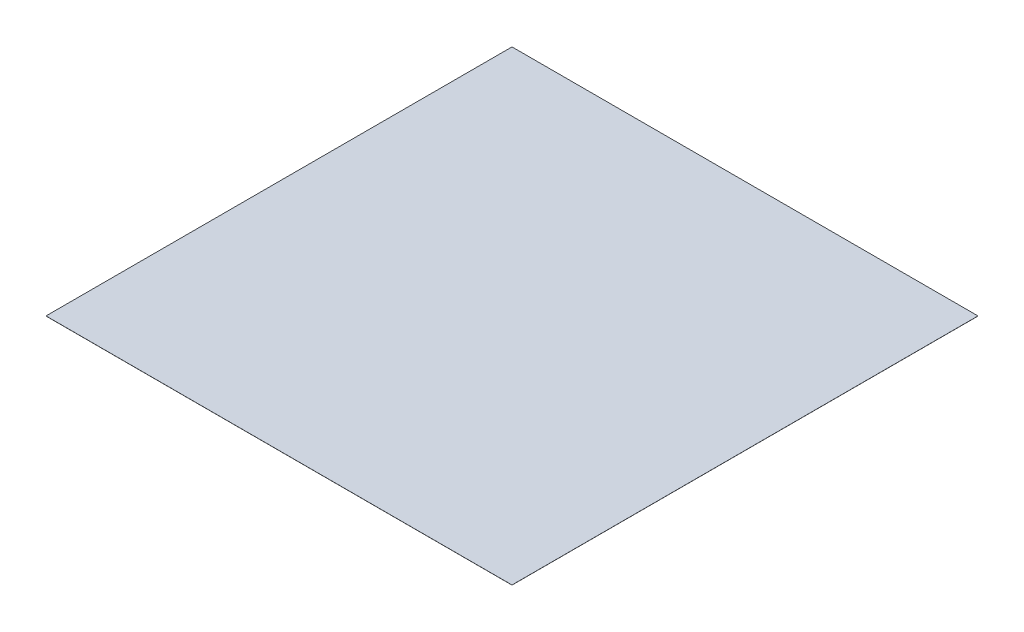
ISO-10303-21;
HEADER;
FILE_DESCRIPTION(('STEP AP214'),'2;1');
FILE_NAME('part.step','',(''),(''),'','','');
FILE_SCHEMA(('AUTOMOTIVE_DESIGN { 1 0 10303 214 1 1 1 1 }'));
ENDSEC;
DATA;
#1=APPLICATION_CONTEXT('core data for automotive mechanical design processes');
#2=APPLICATION_PROTOCOL_DEFINITION('international standard','automotive_design',2000,#1);
#3=PRODUCT_CONTEXT('',#1,'mechanical');
#4=PRODUCT('Part','Part','',(#3));
#5=PRODUCT_RELATED_PRODUCT_CATEGORY('part','',(#4));
#6=PRODUCT_DEFINITION_FORMATION('','',#4);
#7=PRODUCT_DEFINITION_CONTEXT('part definition',#1,'design');
#8=PRODUCT_DEFINITION('design','',#6,#7);
#9=PRODUCT_DEFINITION_SHAPE('','',#8);
#10=(LENGTH_UNIT() NAMED_UNIT(*) SI_UNIT(.MILLI.,.METRE.));
#11=(NAMED_UNIT(*) PLANE_ANGLE_UNIT() SI_UNIT($,.RADIAN.));
#12=(NAMED_UNIT(*) SI_UNIT($,.STERADIAN.) SOLID_ANGLE_UNIT());
#13=UNCERTAINTY_MEASURE_WITH_UNIT(LENGTH_MEASURE(1.E-05),#10,'distance_accuracy_value','');
#14=(GEOMETRIC_REPRESENTATION_CONTEXT(3) GLOBAL_UNCERTAINTY_ASSIGNED_CONTEXT((#13)) GLOBAL_UNIT_ASSIGNED_CONTEXT((#10,
#11,#12)) REPRESENTATION_CONTEXT('',''));
#15=CARTESIAN_POINT('',(0.,0.,0.));
#16=DIRECTION('',(0.,0.,1.));
#17=DIRECTION('',(1.,0.,0.));
#18=AXIS2_PLACEMENT_3D('',#15,#16,#17);
#19=CARTESIAN_POINT('',(400.,0.2,400.));
#20=DIRECTION('',(-1.,0.,0.));
#21=DIRECTION('',(0.,0.,1.));
#22=AXIS2_PLACEMENT_3D('',#19,#20,#21);
#23=PLANE('',#22);
#24=DIRECTION('',(0.,0.,-1.));
#25=VECTOR('',#24,1.);
#26=CARTESIAN_POINT('',(400.,0.,400.));
#27=LINE('',#26,#25);
#28=CARTESIAN_POINT('',(400.,0.,400.));
#29=VERTEX_POINT('',#28);
#30=CARTESIAN_POINT('',(400.,0.,-400.));
#31=VERTEX_POINT('',#30);
#32=EDGE_CURVE('E102',#29,#31,#27,.T.);
#33=ORIENTED_EDGE('',*,*,#32,.T.);
#34=DIRECTION('',(0.,-1.,0.));
#35=VECTOR('',#34,1.);
#36=CARTESIAN_POINT('',(400.,0.2,-400.));
#37=LINE('',#36,#35);
#38=CARTESIAN_POINT('',(400.,0.2,-400.));
#39=VERTEX_POINT('',#38);
#40=EDGE_CURVE('E11',#39,#31,#37,.T.);
#41=ORIENTED_EDGE('',*,*,#40,.F.);
#42=DIRECTION('',(0.,0.,-1.));
#43=VECTOR('',#42,1.);
#44=CARTESIAN_POINT('',(400.,0.2,400.));
#45=LINE('',#44,#43);
#46=CARTESIAN_POINT('',(400.,0.2,400.));
#47=VERTEX_POINT('',#46);
#48=EDGE_CURVE('E95',#47,#39,#45,.T.);
#49=ORIENTED_EDGE('',*,*,#48,.F.);
#50=DIRECTION('',(0.,-1.,0.));
#51=VECTOR('',#50,1.);
#52=CARTESIAN_POINT('',(400.,0.2,400.));
#53=LINE('',#52,#51);
#54=EDGE_CURVE('E99',#47,#29,#53,.T.);
#55=ORIENTED_EDGE('',*,*,#54,.T.);
#56=EDGE_LOOP('',(#33,#41,#49,#55));
#57=FACE_BOUND('',#56,.T.);
#58=ADVANCED_FACE('F41',(#57),#23,.F.);
#59=CARTESIAN_POINT('',(-400.,0.2,-400.));
#60=DIRECTION('',(0.,0.,1.));
#61=DIRECTION('',(1.,0.,0.));
#62=AXIS2_PLACEMENT_3D('',#59,#60,#61);
#63=PLANE('',#62);
#64=DIRECTION('',(-1.,0.,0.));
#65=VECTOR('',#64,1.);
#66=CARTESIAN_POINT('',(-400.,0.,-400.));
#67=LINE('',#66,#65);
#68=CARTESIAN_POINT('',(-400.,0.,-400.));
#69=VERTEX_POINT('',#68);
#70=EDGE_CURVE('E96',#31,#69,#67,.T.);
#71=ORIENTED_EDGE('',*,*,#70,.T.);
#72=DIRECTION('',(0.,-1.,0.));
#73=VECTOR('',#72,1.);
#74=CARTESIAN_POINT('',(-400.,0.2,-400.));
#75=LINE('',#74,#73);
#76=CARTESIAN_POINT('',(-400.,0.2,-400.));
#77=VERTEX_POINT('',#76);
#78=EDGE_CURVE('E47',#77,#69,#75,.T.);
#79=ORIENTED_EDGE('',*,*,#78,.F.);
#80=DIRECTION('',(-1.,0.,0.));
#81=VECTOR('',#80,1.);
#82=CARTESIAN_POINT('',(-400.,0.2,-400.));
#83=LINE('',#82,#81);
#84=EDGE_CURVE('E87',#39,#77,#83,.T.);
#85=ORIENTED_EDGE('',*,*,#84,.F.);
#86=ORIENTED_EDGE('',*,*,#40,.T.);
#87=EDGE_LOOP('',(#71,#79,#85,#86));
#88=FACE_BOUND('',#87,.T.);
#89=ADVANCED_FACE('F92',(#88),#63,.F.);
#90=CARTESIAN_POINT('',(-400.,0.2,400.));
#91=DIRECTION('',(1.,0.,0.));
#92=DIRECTION('',(0.,0.,-1.));
#93=AXIS2_PLACEMENT_3D('',#90,#91,#92);
#94=PLANE('',#93);
#95=DIRECTION('',(0.,0.,1.));
#96=VECTOR('',#95,1.);
#97=CARTESIAN_POINT('',(-400.,0.,400.));
#98=LINE('',#97,#96);
#99=CARTESIAN_POINT('',(-400.,0.,400.));
#100=VERTEX_POINT('',#99);
#101=EDGE_CURVE('E74',#69,#100,#98,.T.);
#102=ORIENTED_EDGE('',*,*,#101,.T.);
#103=DIRECTION('',(0.,-1.,0.));
#104=VECTOR('',#103,1.);
#105=CARTESIAN_POINT('',(-400.,0.2,400.));
#106=LINE('',#105,#104);
#107=CARTESIAN_POINT('',(-400.,0.2,400.));
#108=VERTEX_POINT('',#107);
#109=EDGE_CURVE('E100',#108,#100,#106,.T.);
#110=ORIENTED_EDGE('',*,*,#109,.F.);
#111=DIRECTION('',(0.,0.,1.));
#112=VECTOR('',#111,1.);
#113=CARTESIAN_POINT('',(-400.,0.2,400.));
#114=LINE('',#113,#112);
#115=EDGE_CURVE('E89',#77,#108,#114,.T.);
#116=ORIENTED_EDGE('',*,*,#115,.F.);
#117=ORIENTED_EDGE('',*,*,#78,.T.);
#118=EDGE_LOOP('',(#102,#110,#116,#117));
#119=FACE_BOUND('',#118,.T.);
#120=ADVANCED_FACE('F98',(#119),#94,.F.);
#121=CARTESIAN_POINT('',(-400.,0.2,400.));
#122=DIRECTION('',(0.,0.,-1.));
#123=DIRECTION('',(-1.,0.,0.));
#124=AXIS2_PLACEMENT_3D('',#121,#122,#123);
#125=PLANE('',#124);
#126=DIRECTION('',(1.,0.,0.));
#127=VECTOR('',#126,1.);
#128=CARTESIAN_POINT('',(-400.,0.,400.));
#129=LINE('',#128,#127);
#130=EDGE_CURVE('E79',#100,#29,#129,.T.);
#131=ORIENTED_EDGE('',*,*,#130,.T.);
#132=ORIENTED_EDGE('',*,*,#54,.F.);
#133=DIRECTION('',(1.,0.,0.));
#134=VECTOR('',#133,1.);
#135=CARTESIAN_POINT('',(-400.,0.2,400.));
#136=LINE('',#135,#134);
#137=EDGE_CURVE('E60',#108,#47,#136,.T.);
#138=ORIENTED_EDGE('',*,*,#137,.F.);
#139=ORIENTED_EDGE('',*,*,#109,.T.);
#140=EDGE_LOOP('',(#131,#132,#138,#139));
#141=FACE_BOUND('',#140,.T.);
#142=ADVANCED_FACE('F112',(#141),#125,.F.);
#143=CARTESIAN_POINT('',(0.,0.2,0.));
#144=DIRECTION('',(0.,-1.,0.));
#145=DIRECTION('',(0.,0.,-1.));
#146=AXIS2_PLACEMENT_3D('',#143,#144,#145);
#147=PLANE('',#146);
#148=ORIENTED_EDGE('',*,*,#48,.T.);
#149=ORIENTED_EDGE('',*,*,#84,.T.);
#150=ORIENTED_EDGE('',*,*,#115,.T.);
#151=ORIENTED_EDGE('',*,*,#137,.T.);
#152=EDGE_LOOP('',(#148,#149,#150,#151));
#153=FACE_BOUND('',#152,.T.);
#154=ADVANCED_FACE('F86',(#153),#147,.F.);
#155=CARTESIAN_POINT('',(0.,0.,0.));
#156=DIRECTION('',(0.,-1.,0.));
#157=DIRECTION('',(0.,0.,-1.));
#158=AXIS2_PLACEMENT_3D('',#155,#156,#157);
#159=PLANE('',#158);
#160=ORIENTED_EDGE('',*,*,#32,.F.);
#161=ORIENTED_EDGE('',*,*,#130,.F.);
#162=ORIENTED_EDGE('',*,*,#101,.F.);
#163=ORIENTED_EDGE('',*,*,#70,.F.);
#164=EDGE_LOOP('',(#160,#161,#162,#163));
#165=FACE_BOUND('',#164,.T.);
#166=ADVANCED_FACE('F111',(#165),#159,.T.);
#167=CLOSED_SHELL('',(#58,#89,#120,#142,#154,#166));
#168=MANIFOLD_SOLID_BREP('B2',#167);
#169=ADVANCED_BREP_SHAPE_REPRESENTATION('',(#18,#168),#14);
#170=SHAPE_DEFINITION_REPRESENTATION(#9,#169);
ENDSEC;
END-ISO-10303-21;
